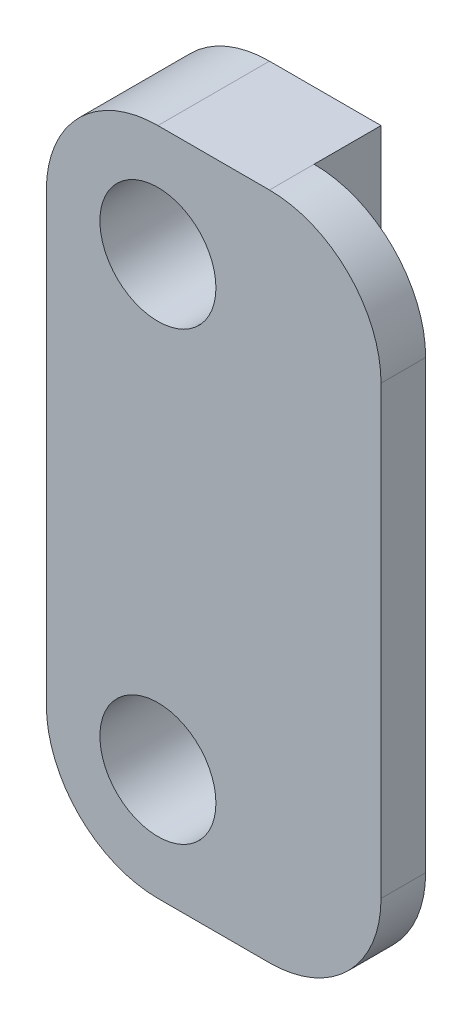
ISO-10303-21;
HEADER;
FILE_DESCRIPTION(('STEP AP214'),'2;1');
FILE_NAME('part.step','',(''),(''),'','','');
FILE_SCHEMA(('AUTOMOTIVE_DESIGN { 1 0 10303 214 1 1 1 1 }'));
ENDSEC;
DATA;
#1=APPLICATION_CONTEXT('core data for automotive mechanical design processes');
#2=APPLICATION_PROTOCOL_DEFINITION('international standard','automotive_design',2000,#1);
#3=PRODUCT_CONTEXT('',#1,'mechanical');
#4=PRODUCT('Part','Part','',(#3));
#5=PRODUCT_RELATED_PRODUCT_CATEGORY('part','',(#4));
#6=PRODUCT_DEFINITION_FORMATION('','',#4);
#7=PRODUCT_DEFINITION_CONTEXT('part definition',#1,'design');
#8=PRODUCT_DEFINITION('design','',#6,#7);
#9=PRODUCT_DEFINITION_SHAPE('','',#8);
#10=(LENGTH_UNIT() NAMED_UNIT(*) SI_UNIT(.MILLI.,.METRE.));
#11=(NAMED_UNIT(*) PLANE_ANGLE_UNIT() SI_UNIT($,.RADIAN.));
#12=(NAMED_UNIT(*) SI_UNIT($,.STERADIAN.) SOLID_ANGLE_UNIT());
#13=UNCERTAINTY_MEASURE_WITH_UNIT(LENGTH_MEASURE(1.E-05),#10,'distance_accuracy_value','');
#14=(GEOMETRIC_REPRESENTATION_CONTEXT(3) GLOBAL_UNCERTAINTY_ASSIGNED_CONTEXT((#13)) GLOBAL_UNIT_ASSIGNED_CONTEXT((#10,
#11,#12)) REPRESENTATION_CONTEXT('',''));
#15=CARTESIAN_POINT('',(0.,0.,0.));
#16=DIRECTION('',(0.,0.,1.));
#17=DIRECTION('',(1.,0.,0.));
#18=AXIS2_PLACEMENT_3D('',#15,#16,#17);
#19=CARTESIAN_POINT('',(44.9999999999973,-82.2499999999999,5.));
#20=DIRECTION('',(-1.,0.,0.));
#21=DIRECTION('',(0.,0.,1.));
#22=AXIS2_PLACEMENT_3D('',#19,#20,#21);
#23=PLANE('',#22);
#24=DIRECTION('',(0.,1.,0.));
#25=VECTOR('',#24,1.);
#26=CARTESIAN_POINT('',(44.9999999999973,-52.25,3.));
#27=LINE('',#26,#25);
#28=CARTESIAN_POINT('',(44.9999999999973,-82.2499999999999,3.));
#29=VERTEX_POINT('',#28);
#30=CARTESIAN_POINT('',(44.9999999999973,-52.25,3.));
#31=VERTEX_POINT('',#30);
#32=EDGE_CURVE('E135',#29,#31,#27,.T.);
#33=ORIENTED_EDGE('',*,*,#32,.F.);
#34=DIRECTION('',(0.,0.,-1.));
#35=VECTOR('',#34,1.);
#36=CARTESIAN_POINT('',(44.9999999999973,-82.2499999999999,5.));
#37=LINE('',#36,#35);
#38=CARTESIAN_POINT('',(44.9999999999973,-82.2499999999999,0.));
#39=VERTEX_POINT('',#38);
#40=EDGE_CURVE('E140',#29,#39,#37,.T.);
#41=ORIENTED_EDGE('',*,*,#40,.T.);
#42=DIRECTION('',(0.,1.,0.));
#43=VECTOR('',#42,1.);
#44=CARTESIAN_POINT('',(44.9999999999973,-82.2499999999999,0.));
#45=LINE('',#44,#43);
#46=CARTESIAN_POINT('',(44.9999999999973,-52.25,0.));
#47=VERTEX_POINT('',#46);
#48=EDGE_CURVE('E138',#39,#47,#45,.T.);
#49=ORIENTED_EDGE('',*,*,#48,.T.);
#50=DIRECTION('',(0.,0.,-1.));
#51=VECTOR('',#50,1.);
#52=CARTESIAN_POINT('',(44.9999999999973,-52.25,5.));
#53=LINE('',#52,#51);
#54=EDGE_CURVE('E121',#31,#47,#53,.T.);
#55=ORIENTED_EDGE('',*,*,#54,.F.);
#56=EDGE_LOOP('',(#33,#41,#49,#55));
#57=FACE_BOUND('',#56,.T.);
#58=ADVANCED_FACE('F47',(#57),#23,.F.);
#59=CARTESIAN_POINT('',(0.,0.,5.));
#60=DIRECTION('',(0.,0.,1.));
#61=DIRECTION('',(1.,0.,0.));
#62=AXIS2_PLACEMENT_3D('',#59,#60,#61);
#63=PLANE('',#62);
#64=CARTESIAN_POINT('',(39.9999999999973,-77.25,5.));
#65=DIRECTION('',(0.,0.,1.));
#66=DIRECTION('',(1.,0.,0.));
#67=AXIS2_PLACEMENT_3D('',#64,#65,#66);
#68=CIRCLE('',#67,2.6);
#69=CARTESIAN_POINT('',(42.5999999999973,-77.25,5.));
#70=VERTEX_POINT('',#69);
#71=EDGE_CURVE('E215',#70,#70,#68,.T.);
#72=ORIENTED_EDGE('',*,*,#71,.F.);
#73=EDGE_LOOP('',(#72));
#74=FACE_BOUND('',#73,.T.);
#75=DIRECTION('',(1.,0.,0.));
#76=VECTOR('',#75,1.);
#77=CARTESIAN_POINT('',(44.9999999999973,-82.2499999999999,5.));
#78=LINE('',#77,#76);
#79=CARTESIAN_POINT('',(39.9999999999973,-82.25,5.));
#80=VERTEX_POINT('',#79);
#81=CARTESIAN_POINT('',(44.9999999999973,-82.2499999999999,5.));
#82=VERTEX_POINT('',#81);
#83=EDGE_CURVE('E193',#80,#82,#78,.T.);
#84=ORIENTED_EDGE('',*,*,#83,.T.);
#85=CARTESIAN_POINT('',(44.9999999999973,-77.2499999999999,5.));
#86=DIRECTION('',(0.,0.,1.));
#87=DIRECTION('',(1.,0.,0.));
#88=AXIS2_PLACEMENT_3D('',#85,#86,#87);
#89=CIRCLE('',#88,5.);
#90=CARTESIAN_POINT('',(49.9999999999973,-77.2499999999999,5.));
#91=VERTEX_POINT('',#90);
#92=EDGE_CURVE('E171',#82,#91,#89,.T.);
#93=ORIENTED_EDGE('',*,*,#92,.T.);
#94=DIRECTION('',(0.,-1.,0.));
#95=VECTOR('',#94,1.);
#96=CARTESIAN_POINT('',(49.9999999999973,-52.25,5.));
#97=LINE('',#96,#95);
#98=CARTESIAN_POINT('',(49.9999999999973,-57.25,5.));
#99=VERTEX_POINT('',#98);
#100=EDGE_CURVE('E148',#99,#91,#97,.T.);
#101=ORIENTED_EDGE('',*,*,#100,.F.);
#102=CARTESIAN_POINT('',(44.9999999999973,-57.25,5.));
#103=DIRECTION('',(0.,0.,1.));
#104=DIRECTION('',(1.,0.,0.));
#105=AXIS2_PLACEMENT_3D('',#102,#103,#104);
#106=CIRCLE('',#105,5.);
#107=CARTESIAN_POINT('',(44.9999999999973,-52.25,5.));
#108=VERTEX_POINT('',#107);
#109=EDGE_CURVE('E169',#99,#108,#106,.T.);
#110=ORIENTED_EDGE('',*,*,#109,.T.);
#111=DIRECTION('',(-1.,0.,0.));
#112=VECTOR('',#111,1.);
#113=CARTESIAN_POINT('',(44.9999999999973,-52.25,5.));
#114=LINE('',#113,#112);
#115=CARTESIAN_POINT('',(39.9999999999973,-52.25,5.));
#116=VERTEX_POINT('',#115);
#117=EDGE_CURVE('E124',#108,#116,#114,.T.);
#118=ORIENTED_EDGE('',*,*,#117,.T.);
#119=CARTESIAN_POINT('',(39.9999999999973,-57.25,5.));
#120=DIRECTION('',(0.,0.,1.));
#121=DIRECTION('',(1.,0.,0.));
#122=AXIS2_PLACEMENT_3D('',#119,#120,#121);
#123=CIRCLE('',#122,5.);
#124=CARTESIAN_POINT('',(34.9999999999973,-57.25,5.));
#125=VERTEX_POINT('',#124);
#126=EDGE_CURVE('E167',#116,#125,#123,.T.);
#127=ORIENTED_EDGE('',*,*,#126,.T.);
#128=DIRECTION('',(0.,-1.,0.));
#129=VECTOR('',#128,1.);
#130=CARTESIAN_POINT('',(34.9999999999973,-82.25,5.));
#131=LINE('',#130,#129);
#132=CARTESIAN_POINT('',(34.9999999999973,-77.25,5.));
#133=VERTEX_POINT('',#132);
#134=EDGE_CURVE('E182',#125,#133,#131,.T.);
#135=ORIENTED_EDGE('',*,*,#134,.T.);
#136=CARTESIAN_POINT('',(39.9999999999973,-77.25,5.));
#137=DIRECTION('',(0.,0.,1.));
#138=DIRECTION('',(1.,0.,0.));
#139=AXIS2_PLACEMENT_3D('',#136,#137,#138);
#140=CIRCLE('',#139,5.);
#141=EDGE_CURVE('E165',#133,#80,#140,.T.);
#142=ORIENTED_EDGE('',*,*,#141,.T.);
#143=EDGE_LOOP('',(#84,#93,#101,#110,#118,#127,#135,#142));
#144=FACE_BOUND('',#143,.T.);
#145=CARTESIAN_POINT('',(39.9999999999973,-57.25,5.));
#146=DIRECTION('',(0.,0.,1.));
#147=DIRECTION('',(1.,0.,0.));
#148=AXIS2_PLACEMENT_3D('',#145,#146,#147);
#149=CIRCLE('',#148,2.6);
#150=CARTESIAN_POINT('',(42.5999999999973,-57.25,5.));
#151=VERTEX_POINT('',#150);
#152=EDGE_CURVE('E209',#151,#151,#149,.T.);
#153=ORIENTED_EDGE('',*,*,#152,.F.);
#154=EDGE_LOOP('',(#153));
#155=FACE_BOUND('',#154,.T.);
#156=ADVANCED_FACE('F202',(#74,#144,#155),#63,.T.);
#157=CARTESIAN_POINT('',(0.,0.,0.));
#158=DIRECTION('',(0.,0.,1.));
#159=DIRECTION('',(1.,0.,0.));
#160=AXIS2_PLACEMENT_3D('',#157,#158,#159);
#161=PLANE('',#160);
#162=DIRECTION('',(0.,-1.,0.));
#163=VECTOR('',#162,1.);
#164=CARTESIAN_POINT('',(34.9999999999973,-82.25,0.));
#165=LINE('',#164,#163);
#166=CARTESIAN_POINT('',(34.9999999999973,-57.25,0.));
#167=VERTEX_POINT('',#166);
#168=CARTESIAN_POINT('',(34.9999999999973,-77.25,0.));
#169=VERTEX_POINT('',#168);
#170=EDGE_CURVE('E179',#167,#169,#165,.T.);
#171=ORIENTED_EDGE('',*,*,#170,.F.);
#172=CARTESIAN_POINT('',(39.9999999999973,-57.25,0.));
#173=DIRECTION('',(0.,0.,1.));
#174=DIRECTION('',(1.,0.,0.));
#175=AXIS2_PLACEMENT_3D('',#172,#173,#174);
#176=CIRCLE('',#175,5.);
#177=CARTESIAN_POINT('',(39.9999999999973,-52.25,0.));
#178=VERTEX_POINT('',#177);
#179=EDGE_CURVE('E13',#167,#178,#176,.F.);
#180=ORIENTED_EDGE('',*,*,#179,.T.);
#181=DIRECTION('',(-1.,0.,0.));
#182=VECTOR('',#181,1.);
#183=CARTESIAN_POINT('',(44.9999999999973,-52.25,0.));
#184=LINE('',#183,#182);
#185=EDGE_CURVE('E187',#47,#178,#184,.T.);
#186=ORIENTED_EDGE('',*,*,#185,.F.);
#187=ORIENTED_EDGE('',*,*,#48,.F.);
#188=DIRECTION('',(1.,0.,0.));
#189=VECTOR('',#188,1.);
#190=CARTESIAN_POINT('',(44.9999999999973,-82.2499999999999,0.));
#191=LINE('',#190,#189);
#192=CARTESIAN_POINT('',(39.9999999999973,-82.25,0.));
#193=VERTEX_POINT('',#192);
#194=EDGE_CURVE('E186',#193,#39,#191,.T.);
#195=ORIENTED_EDGE('',*,*,#194,.F.);
#196=CARTESIAN_POINT('',(39.9999999999973,-77.25,0.));
#197=DIRECTION('',(0.,0.,1.));
#198=DIRECTION('',(1.,0.,0.));
#199=AXIS2_PLACEMENT_3D('',#196,#197,#198);
#200=CIRCLE('',#199,5.);
#201=EDGE_CURVE('E55',#193,#169,#200,.F.);
#202=ORIENTED_EDGE('',*,*,#201,.T.);
#203=EDGE_LOOP('',(#171,#180,#186,#187,#195,#202));
#204=FACE_BOUND('',#203,.T.);
#205=CARTESIAN_POINT('',(39.9999999999973,-77.25,0.));
#206=DIRECTION('',(0.,0.,1.));
#207=DIRECTION('',(1.,0.,0.));
#208=AXIS2_PLACEMENT_3D('',#205,#206,#207);
#209=CIRCLE('',#208,2.6);
#210=CARTESIAN_POINT('',(42.5999999999973,-77.25,0.));
#211=VERTEX_POINT('',#210);
#212=EDGE_CURVE('E212',#211,#211,#209,.T.);
#213=ORIENTED_EDGE('',*,*,#212,.T.);
#214=EDGE_LOOP('',(#213));
#215=FACE_BOUND('',#214,.T.);
#216=CARTESIAN_POINT('',(39.9999999999973,-57.25,0.));
#217=DIRECTION('',(0.,0.,1.));
#218=DIRECTION('',(1.,0.,0.));
#219=AXIS2_PLACEMENT_3D('',#216,#217,#218);
#220=CIRCLE('',#219,2.6);
#221=CARTESIAN_POINT('',(42.5999999999973,-57.25,0.));
#222=VERTEX_POINT('',#221);
#223=EDGE_CURVE('E206',#222,#222,#220,.T.);
#224=ORIENTED_EDGE('',*,*,#223,.T.);
#225=EDGE_LOOP('',(#224));
#226=FACE_BOUND('',#225,.T.);
#227=ADVANCED_FACE('F184',(#204,#215,#226),#161,.F.);
#228=CARTESIAN_POINT('',(44.9999999999973,-52.25,5.));
#229=DIRECTION('',(0.,-1.,0.));
#230=DIRECTION('',(1.,0.,0.));
#231=AXIS2_PLACEMENT_3D('',#228,#229,#230);
#232=PLANE('',#231);
#233=ORIENTED_EDGE('',*,*,#117,.F.);
#234=DIRECTION('',(0.,0.,1.));
#235=VECTOR('',#234,1.);
#236=CARTESIAN_POINT('',(44.9999999999973,-52.25,3.));
#237=LINE('',#236,#235);
#238=EDGE_CURVE('E117',#108,#31,#237,.F.);
#239=ORIENTED_EDGE('',*,*,#238,.T.);
#240=ORIENTED_EDGE('',*,*,#54,.T.);
#241=ORIENTED_EDGE('',*,*,#185,.T.);
#242=DIRECTION('',(0.,0.,-1.));
#243=VECTOR('',#242,1.);
#244=CARTESIAN_POINT('',(39.9999999999973,-52.25,5.));
#245=LINE('',#244,#243);
#246=EDGE_CURVE('E128',#178,#116,#245,.F.);
#247=ORIENTED_EDGE('',*,*,#246,.T.);
#248=EDGE_LOOP('',(#233,#239,#240,#241,#247));
#249=FACE_BOUND('',#248,.T.);
#250=ADVANCED_FACE('F119',(#249),#232,.F.);
#251=CARTESIAN_POINT('',(34.9999999999973,-82.25,5.));
#252=DIRECTION('',(1.,0.,0.));
#253=DIRECTION('',(0.,0.,-1.));
#254=AXIS2_PLACEMENT_3D('',#251,#252,#253);
#255=PLANE('',#254);
#256=ORIENTED_EDGE('',*,*,#134,.F.);
#257=DIRECTION('',(0.,0.,-1.));
#258=VECTOR('',#257,1.);
#259=CARTESIAN_POINT('',(34.9999999999973,-57.25,5.));
#260=LINE('',#259,#258);
#261=EDGE_CURVE('E175',#125,#167,#260,.T.);
#262=ORIENTED_EDGE('',*,*,#261,.T.);
#263=ORIENTED_EDGE('',*,*,#170,.T.);
#264=DIRECTION('',(0.,0.,-1.));
#265=VECTOR('',#264,1.);
#266=CARTESIAN_POINT('',(34.9999999999973,-77.25,5.));
#267=LINE('',#266,#265);
#268=EDGE_CURVE('E127',#169,#133,#267,.F.);
#269=ORIENTED_EDGE('',*,*,#268,.T.);
#270=EDGE_LOOP('',(#256,#262,#263,#269));
#271=FACE_BOUND('',#270,.T.);
#272=ADVANCED_FACE('F178',(#271),#255,.F.);
#273=CARTESIAN_POINT('',(44.9999999999973,-82.2499999999999,5.));
#274=DIRECTION('',(0.,1.,0.));
#275=DIRECTION('',(-1.,0.,0.));
#276=AXIS2_PLACEMENT_3D('',#273,#274,#275);
#277=PLANE('',#276);
#278=ORIENTED_EDGE('',*,*,#40,.F.);
#279=DIRECTION('',(0.,0.,-1.));
#280=VECTOR('',#279,1.);
#281=CARTESIAN_POINT('',(44.9999999999973,-82.2499999999999,5.));
#282=LINE('',#281,#280);
#283=EDGE_CURVE('E163',#29,#82,#282,.F.);
#284=ORIENTED_EDGE('',*,*,#283,.T.);
#285=ORIENTED_EDGE('',*,*,#83,.F.);
#286=DIRECTION('',(0.,0.,-1.));
#287=VECTOR('',#286,1.);
#288=CARTESIAN_POINT('',(39.9999999999973,-82.25,5.));
#289=LINE('',#288,#287);
#290=EDGE_CURVE('E155',#80,#193,#289,.T.);
#291=ORIENTED_EDGE('',*,*,#290,.T.);
#292=ORIENTED_EDGE('',*,*,#194,.T.);
#293=EDGE_LOOP('',(#278,#284,#285,#291,#292));
#294=FACE_BOUND('',#293,.T.);
#295=ADVANCED_FACE('F229',(#294),#277,.F.);
#296=CARTESIAN_POINT('',(39.9999999999973,-77.25,5.));
#297=DIRECTION('',(0.,0.,-1.));
#298=DIRECTION('',(-1.,0.,0.));
#299=AXIS2_PLACEMENT_3D('',#296,#297,#298);
#300=CYLINDRICAL_SURFACE('',#299,2.6);
#301=ORIENTED_EDGE('',*,*,#71,.T.);
#302=EDGE_LOOP('',(#301));
#303=FACE_BOUND('',#302,.T.);
#304=ORIENTED_EDGE('',*,*,#212,.F.);
#305=EDGE_LOOP('',(#304));
#306=FACE_BOUND('',#305,.T.);
#307=ADVANCED_FACE('F293',(#303,#306),#300,.F.);
#308=CARTESIAN_POINT('',(39.9999999999973,-57.25,5.));
#309=DIRECTION('',(0.,0.,-1.));
#310=DIRECTION('',(-1.,0.,0.));
#311=AXIS2_PLACEMENT_3D('',#308,#309,#310);
#312=CYLINDRICAL_SURFACE('',#311,2.6);
#313=ORIENTED_EDGE('',*,*,#152,.T.);
#314=EDGE_LOOP('',(#313));
#315=FACE_BOUND('',#314,.T.);
#316=ORIENTED_EDGE('',*,*,#223,.F.);
#317=EDGE_LOOP('',(#316));
#318=FACE_BOUND('',#317,.T.);
#319=ADVANCED_FACE('F284',(#315,#318),#312,.F.);
#320=CARTESIAN_POINT('',(49.9999999999973,-52.25,3.));
#321=DIRECTION('',(0.,0.,1.));
#322=DIRECTION('',(0.,-1.,0.));
#323=AXIS2_PLACEMENT_3D('',#320,#321,#322);
#324=PLANE('',#323);
#325=DIRECTION('',(0.,1.,0.));
#326=VECTOR('',#325,1.);
#327=CARTESIAN_POINT('',(49.9999999999973,-52.25,3.));
#328=LINE('',#327,#326);
#329=CARTESIAN_POINT('',(49.9999999999973,-77.2499999999999,3.));
#330=VERTEX_POINT('',#329);
#331=CARTESIAN_POINT('',(49.9999999999973,-57.25,3.));
#332=VERTEX_POINT('',#331);
#333=EDGE_CURVE('E199',#330,#332,#328,.T.);
#334=ORIENTED_EDGE('',*,*,#333,.F.);
#335=CARTESIAN_POINT('',(44.9999999999973,-77.2499999999999,3.));
#336=DIRECTION('',(0.,0.,1.));
#337=DIRECTION('',(0.,-1.,0.));
#338=AXIS2_PLACEMENT_3D('',#335,#336,#337);
#339=CIRCLE('',#338,5.);
#340=EDGE_CURVE('E147',#330,#29,#339,.F.);
#341=ORIENTED_EDGE('',*,*,#340,.T.);
#342=ORIENTED_EDGE('',*,*,#32,.T.);
#343=CARTESIAN_POINT('',(44.9999999999973,-57.25,3.));
#344=DIRECTION('',(0.,0.,1.));
#345=DIRECTION('',(0.,-1.,0.));
#346=AXIS2_PLACEMENT_3D('',#343,#344,#345);
#347=CIRCLE('',#346,5.);
#348=EDGE_CURVE('E145',#31,#332,#347,.F.);
#349=ORIENTED_EDGE('',*,*,#348,.T.);
#350=EDGE_LOOP('',(#334,#341,#342,#349));
#351=FACE_BOUND('',#350,.T.);
#352=ADVANCED_FACE('F144',(#351),#324,.F.);
#353=CARTESIAN_POINT('',(49.9999999999973,0.,0.));
#354=DIRECTION('',(1.,0.,0.));
#355=DIRECTION('',(0.,0.,-1.));
#356=AXIS2_PLACEMENT_3D('',#353,#354,#355);
#357=PLANE('',#356);
#358=ORIENTED_EDGE('',*,*,#100,.T.);
#359=DIRECTION('',(0.,0.,-1.));
#360=VECTOR('',#359,1.);
#361=CARTESIAN_POINT('',(49.9999999999973,-77.2499999999999,3.));
#362=LINE('',#361,#360);
#363=EDGE_CURVE('E153',#91,#330,#362,.T.);
#364=ORIENTED_EDGE('',*,*,#363,.T.);
#365=ORIENTED_EDGE('',*,*,#333,.T.);
#366=DIRECTION('',(0.,0.,1.));
#367=VECTOR('',#366,1.);
#368=CARTESIAN_POINT('',(49.9999999999973,-57.25,5.));
#369=LINE('',#368,#367);
#370=EDGE_CURVE('E139',#332,#99,#369,.T.);
#371=ORIENTED_EDGE('',*,*,#370,.T.);
#372=EDGE_LOOP('',(#358,#364,#365,#371));
#373=FACE_BOUND('',#372,.T.);
#374=ADVANCED_FACE('F197',(#373),#357,.T.);
#375=CARTESIAN_POINT('',(44.9999999999973,-77.2499999999999,0.));
#376=DIRECTION('',(0.,0.,1.));
#377=DIRECTION('',(1.,0.,0.));
#378=AXIS2_PLACEMENT_3D('',#375,#376,#377);
#379=CYLINDRICAL_SURFACE('',#378,5.);
#380=ORIENTED_EDGE('',*,*,#92,.F.);
#381=ORIENTED_EDGE('',*,*,#283,.F.);
#382=ORIENTED_EDGE('',*,*,#340,.F.);
#383=ORIENTED_EDGE('',*,*,#363,.F.);
#384=EDGE_LOOP('',(#380,#381,#382,#383));
#385=FACE_BOUND('',#384,.T.);
#386=ADVANCED_FACE('F228',(#385),#379,.T.);
#387=CARTESIAN_POINT('',(44.9999999999973,-57.25,0.));
#388=DIRECTION('',(0.,0.,-1.));
#389=DIRECTION('',(-1.,0.,0.));
#390=AXIS2_PLACEMENT_3D('',#387,#388,#389);
#391=CYLINDRICAL_SURFACE('',#390,5.);
#392=ORIENTED_EDGE('',*,*,#348,.F.);
#393=ORIENTED_EDGE('',*,*,#238,.F.);
#394=ORIENTED_EDGE('',*,*,#109,.F.);
#395=ORIENTED_EDGE('',*,*,#370,.F.);
#396=EDGE_LOOP('',(#392,#393,#394,#395));
#397=FACE_BOUND('',#396,.T.);
#398=ADVANCED_FACE('F151',(#397),#391,.T.);
#399=CARTESIAN_POINT('',(39.9999999999973,-57.25,5.));
#400=DIRECTION('',(0.,0.,-1.));
#401=DIRECTION('',(-1.,0.,0.));
#402=AXIS2_PLACEMENT_3D('',#399,#400,#401);
#403=CYLINDRICAL_SURFACE('',#402,5.);
#404=ORIENTED_EDGE('',*,*,#126,.F.);
#405=ORIENTED_EDGE('',*,*,#246,.F.);
#406=ORIENTED_EDGE('',*,*,#179,.F.);
#407=ORIENTED_EDGE('',*,*,#261,.F.);
#408=EDGE_LOOP('',(#404,#405,#406,#407));
#409=FACE_BOUND('',#408,.T.);
#410=ADVANCED_FACE('F230',(#409),#403,.T.);
#411=CARTESIAN_POINT('',(39.9999999999973,-77.25,5.));
#412=DIRECTION('',(0.,0.,-1.));
#413=DIRECTION('',(-1.,0.,0.));
#414=AXIS2_PLACEMENT_3D('',#411,#412,#413);
#415=CYLINDRICAL_SURFACE('',#414,5.);
#416=ORIENTED_EDGE('',*,*,#141,.F.);
#417=ORIENTED_EDGE('',*,*,#268,.F.);
#418=ORIENTED_EDGE('',*,*,#201,.F.);
#419=ORIENTED_EDGE('',*,*,#290,.F.);
#420=EDGE_LOOP('',(#416,#417,#418,#419));
#421=FACE_BOUND('',#420,.T.);
#422=ADVANCED_FACE('F49',(#421),#415,.T.);
#423=CLOSED_SHELL('',(#58,#156,#227,#250,#272,#295,#307,#319,#352,#374,#386,#398,#410,#422));
#424=MANIFOLD_SOLID_BREP('B2',#423);
#425=ADVANCED_BREP_SHAPE_REPRESENTATION('',(#18,#424),#14);
#426=SHAPE_DEFINITION_REPRESENTATION(#9,#425);
ENDSEC;
END-ISO-10303-21;
